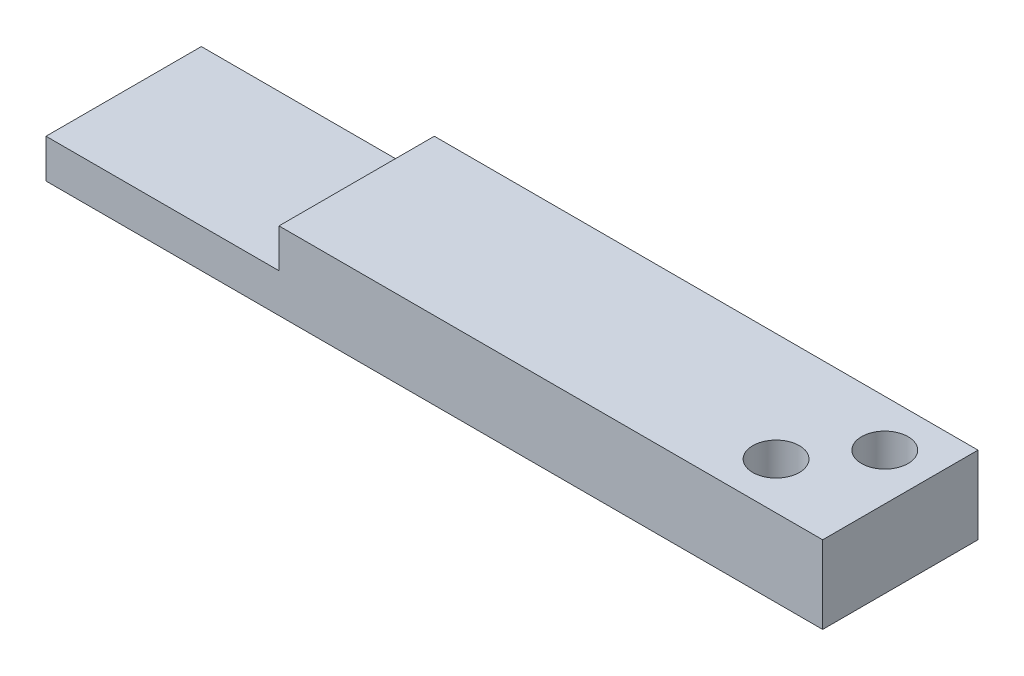
ISO-10303-21;
HEADER;
FILE_DESCRIPTION(('STEP AP214'),'2;1');
FILE_NAME('part.step','',(''),(''),'','','');
FILE_SCHEMA(('AUTOMOTIVE_DESIGN { 1 0 10303 214 1 1 1 1 }'));
ENDSEC;
DATA;
#1=APPLICATION_CONTEXT('core data for automotive mechanical design processes');
#2=APPLICATION_PROTOCOL_DEFINITION('international standard','automotive_design',2000,#1);
#3=PRODUCT_CONTEXT('',#1,'mechanical');
#4=PRODUCT('Part','Part','',(#3));
#5=PRODUCT_RELATED_PRODUCT_CATEGORY('part','',(#4));
#6=PRODUCT_DEFINITION_FORMATION('','',#4);
#7=PRODUCT_DEFINITION_CONTEXT('part definition',#1,'design');
#8=PRODUCT_DEFINITION('design','',#6,#7);
#9=PRODUCT_DEFINITION_SHAPE('','',#8);
#10=(LENGTH_UNIT() NAMED_UNIT(*) SI_UNIT(.MILLI.,.METRE.));
#11=(NAMED_UNIT(*) PLANE_ANGLE_UNIT() SI_UNIT($,.RADIAN.));
#12=(NAMED_UNIT(*) SI_UNIT($,.STERADIAN.) SOLID_ANGLE_UNIT());
#13=UNCERTAINTY_MEASURE_WITH_UNIT(LENGTH_MEASURE(1.E-05),#10,'distance_accuracy_value','');
#14=(GEOMETRIC_REPRESENTATION_CONTEXT(3) GLOBAL_UNCERTAINTY_ASSIGNED_CONTEXT((#13)) GLOBAL_UNIT_ASSIGNED_CONTEXT((#10,
#11,#12)) REPRESENTATION_CONTEXT('',''));
#15=CARTESIAN_POINT('',(0.,0.,0.));
#16=DIRECTION('',(0.,0.,1.));
#17=DIRECTION('',(1.,0.,0.));
#18=AXIS2_PLACEMENT_3D('',#15,#16,#17);
#19=CARTESIAN_POINT('',(25.,5.,5.));
#20=DIRECTION('',(-1.,0.,0.));
#21=DIRECTION('',(0.,0.,1.));
#22=AXIS2_PLACEMENT_3D('',#19,#20,#21);
#23=PLANE('',#22);
#24=DIRECTION('',(0.,0.,-1.));
#25=VECTOR('',#24,1.);
#26=CARTESIAN_POINT('',(25.,0.,5.));
#27=LINE('',#26,#25);
#28=CARTESIAN_POINT('',(25.,0.,5.));
#29=VERTEX_POINT('',#28);
#30=CARTESIAN_POINT('',(25.,0.,-5.));
#31=VERTEX_POINT('',#30);
#32=EDGE_CURVE('E106',#29,#31,#27,.T.);
#33=ORIENTED_EDGE('',*,*,#32,.T.);
#34=DIRECTION('',(0.,-1.,0.));
#35=VECTOR('',#34,1.);
#36=CARTESIAN_POINT('',(25.,5.,-5.));
#37=LINE('',#36,#35);
#38=CARTESIAN_POINT('',(25.,5.,-5.));
#39=VERTEX_POINT('',#38);
#40=EDGE_CURVE('E12',#39,#31,#37,.T.);
#41=ORIENTED_EDGE('',*,*,#40,.F.);
#42=DIRECTION('',(0.,0.,-1.));
#43=VECTOR('',#42,1.);
#44=CARTESIAN_POINT('',(25.,5.,5.));
#45=LINE('',#44,#43);
#46=CARTESIAN_POINT('',(25.,5.,5.));
#47=VERTEX_POINT('',#46);
#48=EDGE_CURVE('E100',#47,#39,#45,.T.);
#49=ORIENTED_EDGE('',*,*,#48,.F.);
#50=DIRECTION('',(0.,-1.,0.));
#51=VECTOR('',#50,1.);
#52=CARTESIAN_POINT('',(25.,5.,5.));
#53=LINE('',#52,#51);
#54=EDGE_CURVE('E90',#47,#29,#53,.T.);
#55=ORIENTED_EDGE('',*,*,#54,.T.);
#56=EDGE_LOOP('',(#33,#41,#49,#55));
#57=FACE_BOUND('',#56,.T.);
#58=ADVANCED_FACE('F45',(#57),#23,.F.);
#59=CARTESIAN_POINT('',(-25.,5.,-5.));
#60=DIRECTION('',(0.,0.,1.));
#61=DIRECTION('',(1.,0.,0.));
#62=AXIS2_PLACEMENT_3D('',#59,#60,#61);
#63=PLANE('',#62);
#64=DIRECTION('',(1.,0.,0.));
#65=VECTOR('',#64,1.);
#66=CARTESIAN_POINT('',(-25.,2.5,-5.));
#67=LINE('',#66,#65);
#68=CARTESIAN_POINT('',(-25.,2.5,-5.));
#69=VERTEX_POINT('',#68);
#70=CARTESIAN_POINT('',(-10.,2.5,-5.));
#71=VERTEX_POINT('',#70);
#72=EDGE_CURVE('E169',#69,#71,#67,.T.);
#73=ORIENTED_EDGE('',*,*,#72,.T.);
#74=DIRECTION('',(0.,1.,0.));
#75=VECTOR('',#74,1.);
#76=CARTESIAN_POINT('',(-10.,5.,-5.));
#77=LINE('',#76,#75);
#78=CARTESIAN_POINT('',(-10.,5.,-5.));
#79=VERTEX_POINT('',#78);
#80=EDGE_CURVE('E142',#71,#79,#77,.T.);
#81=ORIENTED_EDGE('',*,*,#80,.T.);
#82=DIRECTION('',(-1.,0.,0.));
#83=VECTOR('',#82,1.);
#84=CARTESIAN_POINT('',(-25.,5.,-5.));
#85=LINE('',#84,#83);
#86=EDGE_CURVE('E140',#39,#79,#85,.T.);
#87=ORIENTED_EDGE('',*,*,#86,.F.);
#88=ORIENTED_EDGE('',*,*,#40,.T.);
#89=DIRECTION('',(-1.,0.,0.));
#90=VECTOR('',#89,1.);
#91=CARTESIAN_POINT('',(-25.,0.,-5.));
#92=LINE('',#91,#90);
#93=CARTESIAN_POINT('',(-25.,0.,-5.));
#94=VERTEX_POINT('',#93);
#95=EDGE_CURVE('E111',#31,#94,#92,.T.);
#96=ORIENTED_EDGE('',*,*,#95,.T.);
#97=DIRECTION('',(0.,-1.,0.));
#98=VECTOR('',#97,1.);
#99=CARTESIAN_POINT('',(-25.,5.,-5.));
#100=LINE('',#99,#98);
#101=EDGE_CURVE('E53',#69,#94,#100,.T.);
#102=ORIENTED_EDGE('',*,*,#101,.F.);
#103=EDGE_LOOP('',(#73,#81,#87,#88,#96,#102));
#104=FACE_BOUND('',#103,.T.);
#105=ADVANCED_FACE('F137',(#104),#63,.F.);
#106=CARTESIAN_POINT('',(-25.,5.,5.));
#107=DIRECTION('',(1.,0.,0.));
#108=DIRECTION('',(0.,0.,-1.));
#109=AXIS2_PLACEMENT_3D('',#106,#107,#108);
#110=PLANE('',#109);
#111=DIRECTION('',(0.,-1.,0.));
#112=VECTOR('',#111,1.);
#113=CARTESIAN_POINT('',(-25.,5.,5.));
#114=LINE('',#113,#112);
#115=CARTESIAN_POINT('',(-25.,2.5,5.));
#116=VERTEX_POINT('',#115);
#117=CARTESIAN_POINT('',(-25.,0.,5.));
#118=VERTEX_POINT('',#117);
#119=EDGE_CURVE('E94',#116,#118,#114,.T.);
#120=ORIENTED_EDGE('',*,*,#119,.F.);
#121=DIRECTION('',(0.,0.,1.));
#122=VECTOR('',#121,1.);
#123=CARTESIAN_POINT('',(-25.,2.5,-5.));
#124=LINE('',#123,#122);
#125=EDGE_CURVE('E134',#69,#116,#124,.T.);
#126=ORIENTED_EDGE('',*,*,#125,.F.);
#127=ORIENTED_EDGE('',*,*,#101,.T.);
#128=DIRECTION('',(0.,0.,1.));
#129=VECTOR('',#128,1.);
#130=CARTESIAN_POINT('',(-25.,0.,5.));
#131=LINE('',#130,#129);
#132=EDGE_CURVE('E101',#94,#118,#131,.T.);
#133=ORIENTED_EDGE('',*,*,#132,.T.);
#134=EDGE_LOOP('',(#120,#126,#127,#133));
#135=FACE_BOUND('',#134,.T.);
#136=ADVANCED_FACE('F131',(#135),#110,.F.);
#137=CARTESIAN_POINT('',(-25.,5.,5.));
#138=DIRECTION('',(0.,0.,-1.));
#139=DIRECTION('',(-1.,0.,0.));
#140=AXIS2_PLACEMENT_3D('',#137,#138,#139);
#141=PLANE('',#140);
#142=DIRECTION('',(1.,0.,0.));
#143=VECTOR('',#142,1.);
#144=CARTESIAN_POINT('',(-25.,5.,5.));
#145=LINE('',#144,#143);
#146=CARTESIAN_POINT('',(-10.,5.,5.));
#147=VERTEX_POINT('',#146);
#148=EDGE_CURVE('E68',#147,#47,#145,.T.);
#149=ORIENTED_EDGE('',*,*,#148,.F.);
#150=DIRECTION('',(0.,1.,0.));
#151=VECTOR('',#150,1.);
#152=CARTESIAN_POINT('',(-10.,5.,5.));
#153=LINE('',#152,#151);
#154=CARTESIAN_POINT('',(-10.,2.5,5.));
#155=VERTEX_POINT('',#154);
#156=EDGE_CURVE('E60',#155,#147,#153,.T.);
#157=ORIENTED_EDGE('',*,*,#156,.F.);
#158=DIRECTION('',(1.,0.,0.));
#159=VECTOR('',#158,1.);
#160=CARTESIAN_POINT('',(-25.,2.5,5.));
#161=LINE('',#160,#159);
#162=EDGE_CURVE('E170',#116,#155,#161,.T.);
#163=ORIENTED_EDGE('',*,*,#162,.F.);
#164=ORIENTED_EDGE('',*,*,#119,.T.);
#165=DIRECTION('',(1.,0.,0.));
#166=VECTOR('',#165,1.);
#167=CARTESIAN_POINT('',(-25.,0.,5.));
#168=LINE('',#167,#166);
#169=EDGE_CURVE('E87',#118,#29,#168,.T.);
#170=ORIENTED_EDGE('',*,*,#169,.T.);
#171=ORIENTED_EDGE('',*,*,#54,.F.);
#172=EDGE_LOOP('',(#149,#157,#163,#164,#170,#171));
#173=FACE_BOUND('',#172,.T.);
#174=ADVANCED_FACE('F89',(#173),#141,.F.);
#175=CARTESIAN_POINT('',(0.,5.,0.));
#176=DIRECTION('',(0.,-1.,0.));
#177=DIRECTION('',(0.,0.,-1.));
#178=AXIS2_PLACEMENT_3D('',#175,#176,#177);
#179=PLANE('',#178);
#180=CARTESIAN_POINT('',(22.,5.,-2.));
#181=DIRECTION('',(0.,1.,0.));
#182=DIRECTION('',(0.,0.,1.));
#183=AXIS2_PLACEMENT_3D('',#180,#181,#182);
#184=CIRCLE('',#183,1.5);
#185=CARTESIAN_POINT('',(22.,5.,-0.499999999999999));
#186=VERTEX_POINT('',#185);
#187=EDGE_CURVE('E119',#186,#186,#184,.T.);
#188=ORIENTED_EDGE('',*,*,#187,.F.);
#189=EDGE_LOOP('',(#188));
#190=FACE_BOUND('',#189,.T.);
#191=CARTESIAN_POINT('',(19.,5.,2.));
#192=DIRECTION('',(0.,1.,0.));
#193=DIRECTION('',(0.,0.,1.));
#194=AXIS2_PLACEMENT_3D('',#191,#192,#193);
#195=CIRCLE('',#194,1.5);
#196=CARTESIAN_POINT('',(19.,5.,3.5));
#197=VERTEX_POINT('',#196);
#198=EDGE_CURVE('E152',#197,#197,#195,.T.);
#199=ORIENTED_EDGE('',*,*,#198,.F.);
#200=EDGE_LOOP('',(#199));
#201=FACE_BOUND('',#200,.T.);
#202=ORIENTED_EDGE('',*,*,#86,.T.);
#203=DIRECTION('',(0.,0.,1.));
#204=VECTOR('',#203,1.);
#205=CARTESIAN_POINT('',(-10.,5.,-5.));
#206=LINE('',#205,#204);
#207=EDGE_CURVE('E153',#79,#147,#206,.T.);
#208=ORIENTED_EDGE('',*,*,#207,.T.);
#209=ORIENTED_EDGE('',*,*,#148,.T.);
#210=ORIENTED_EDGE('',*,*,#48,.T.);
#211=EDGE_LOOP('',(#202,#208,#209,#210));
#212=FACE_BOUND('',#211,.T.);
#213=ADVANCED_FACE('F144',(#190,#201,#212),#179,.F.);
#214=CARTESIAN_POINT('',(0.,0.,0.));
#215=DIRECTION('',(0.,-1.,0.));
#216=DIRECTION('',(0.,0.,-1.));
#217=AXIS2_PLACEMENT_3D('',#214,#215,#216);
#218=PLANE('',#217);
#219=CARTESIAN_POINT('',(22.,0.,-2.));
#220=DIRECTION('',(0.,1.,0.));
#221=DIRECTION('',(0.,0.,1.));
#222=AXIS2_PLACEMENT_3D('',#219,#220,#221);
#223=CIRCLE('',#222,1.5);
#224=CARTESIAN_POINT('',(22.,0.,-0.499999999999999));
#225=VERTEX_POINT('',#224);
#226=EDGE_CURVE('E113',#225,#225,#223,.T.);
#227=ORIENTED_EDGE('',*,*,#226,.T.);
#228=EDGE_LOOP('',(#227));
#229=FACE_BOUND('',#228,.T.);
#230=CARTESIAN_POINT('',(19.,0.,2.));
#231=DIRECTION('',(0.,1.,0.));
#232=DIRECTION('',(0.,0.,1.));
#233=AXIS2_PLACEMENT_3D('',#230,#231,#232);
#234=CIRCLE('',#233,1.5);
#235=CARTESIAN_POINT('',(19.,0.,3.5));
#236=VERTEX_POINT('',#235);
#237=EDGE_CURVE('E148',#236,#236,#234,.T.);
#238=ORIENTED_EDGE('',*,*,#237,.T.);
#239=EDGE_LOOP('',(#238));
#240=FACE_BOUND('',#239,.T.);
#241=ORIENTED_EDGE('',*,*,#32,.F.);
#242=ORIENTED_EDGE('',*,*,#169,.F.);
#243=ORIENTED_EDGE('',*,*,#132,.F.);
#244=ORIENTED_EDGE('',*,*,#95,.F.);
#245=EDGE_LOOP('',(#241,#242,#243,#244));
#246=FACE_BOUND('',#245,.T.);
#247=ADVANCED_FACE('F109',(#229,#240,#246),#218,.T.);
#248=CARTESIAN_POINT('',(19.,0.,2.));
#249=DIRECTION('',(0.,1.,0.));
#250=DIRECTION('',(0.,0.,1.));
#251=AXIS2_PLACEMENT_3D('',#248,#249,#250);
#252=CYLINDRICAL_SURFACE('',#251,1.5);
#253=ORIENTED_EDGE('',*,*,#237,.F.);
#254=EDGE_LOOP('',(#253));
#255=FACE_BOUND('',#254,.T.);
#256=ORIENTED_EDGE('',*,*,#198,.T.);
#257=EDGE_LOOP('',(#256));
#258=FACE_BOUND('',#257,.T.);
#259=ADVANCED_FACE('F198',(#255,#258),#252,.F.);
#260=CARTESIAN_POINT('',(22.,0.,-2.));
#261=DIRECTION('',(0.,1.,0.));
#262=DIRECTION('',(0.,0.,1.));
#263=AXIS2_PLACEMENT_3D('',#260,#261,#262);
#264=CYLINDRICAL_SURFACE('',#263,1.5);
#265=ORIENTED_EDGE('',*,*,#226,.F.);
#266=EDGE_LOOP('',(#265));
#267=FACE_BOUND('',#266,.T.);
#268=ORIENTED_EDGE('',*,*,#187,.T.);
#269=EDGE_LOOP('',(#268));
#270=FACE_BOUND('',#269,.T.);
#271=ADVANCED_FACE('F191',(#267,#270),#264,.F.);
#272=CARTESIAN_POINT('',(-10.,5.,-5.));
#273=DIRECTION('',(1.,0.,0.));
#274=DIRECTION('',(0.,0.,-1.));
#275=AXIS2_PLACEMENT_3D('',#272,#273,#274);
#276=PLANE('',#275);
#277=ORIENTED_EDGE('',*,*,#156,.T.);
#278=ORIENTED_EDGE('',*,*,#207,.F.);
#279=ORIENTED_EDGE('',*,*,#80,.F.);
#280=DIRECTION('',(0.,0.,1.));
#281=VECTOR('',#280,1.);
#282=CARTESIAN_POINT('',(-10.,2.5,-5.));
#283=LINE('',#282,#281);
#284=EDGE_CURVE('E162',#71,#155,#283,.T.);
#285=ORIENTED_EDGE('',*,*,#284,.T.);
#286=EDGE_LOOP('',(#277,#278,#279,#285));
#287=FACE_BOUND('',#286,.T.);
#288=ADVANCED_FACE('F188',(#287),#276,.F.);
#289=CARTESIAN_POINT('',(-25.,2.5,-5.));
#290=DIRECTION('',(0.,-1.,0.));
#291=DIRECTION('',(1.,0.,0.));
#292=AXIS2_PLACEMENT_3D('',#289,#290,#291);
#293=PLANE('',#292);
#294=ORIENTED_EDGE('',*,*,#162,.T.);
#295=ORIENTED_EDGE('',*,*,#284,.F.);
#296=ORIENTED_EDGE('',*,*,#72,.F.);
#297=ORIENTED_EDGE('',*,*,#125,.T.);
#298=EDGE_LOOP('',(#294,#295,#296,#297));
#299=FACE_BOUND('',#298,.T.);
#300=ADVANCED_FACE('F182',(#299),#293,.F.);
#301=CLOSED_SHELL('',(#58,#105,#136,#174,#213,#247,#259,#271,#288,#300));
#302=MANIFOLD_SOLID_BREP('B2',#301);
#303=ADVANCED_BREP_SHAPE_REPRESENTATION('',(#18,#302),#14);
#304=SHAPE_DEFINITION_REPRESENTATION(#9,#303);
ENDSEC;
END-ISO-10303-21;
